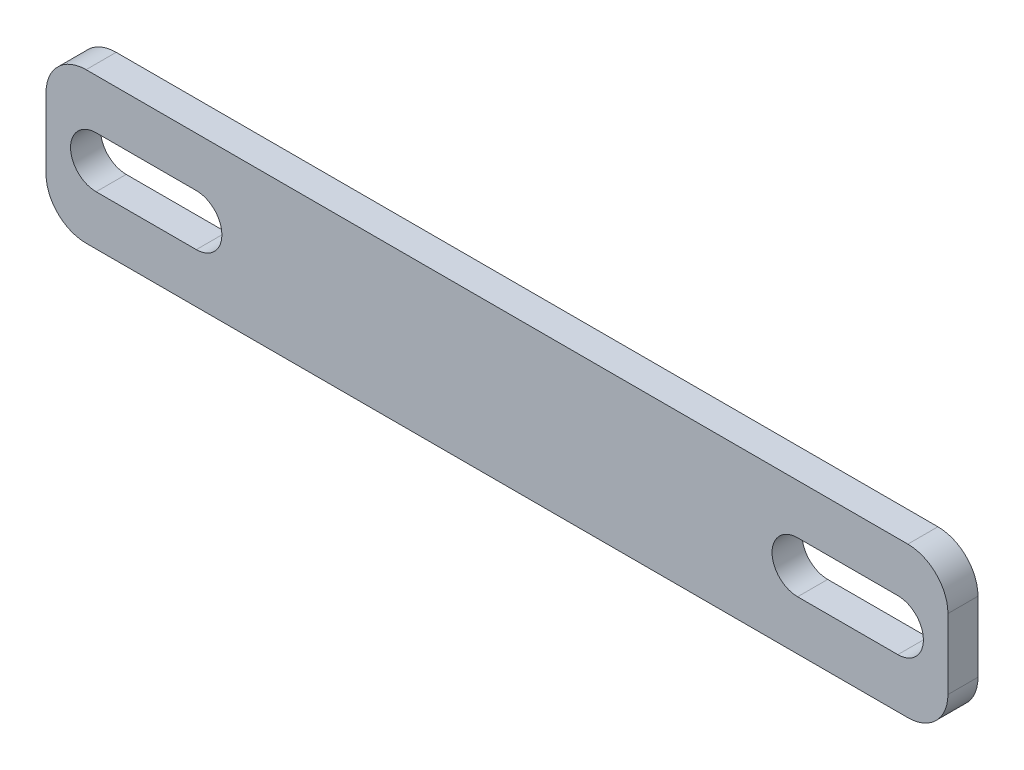
ISO-10303-21;
HEADER;
FILE_DESCRIPTION(('STEP AP214'),'2;1');
FILE_NAME('part.step','',(''),(''),'','','');
FILE_SCHEMA(('AUTOMOTIVE_DESIGN { 1 0 10303 214 1 1 1 1 }'));
ENDSEC;
DATA;
#1=APPLICATION_CONTEXT('core data for automotive mechanical design processes');
#2=APPLICATION_PROTOCOL_DEFINITION('international standard','automotive_design',2000,#1);
#3=PRODUCT_CONTEXT('',#1,'mechanical');
#4=PRODUCT('Part','Part','',(#3));
#5=PRODUCT_RELATED_PRODUCT_CATEGORY('part','',(#4));
#6=PRODUCT_DEFINITION_FORMATION('','',#4);
#7=PRODUCT_DEFINITION_CONTEXT('part definition',#1,'design');
#8=PRODUCT_DEFINITION('design','',#6,#7);
#9=PRODUCT_DEFINITION_SHAPE('','',#8);
#10=(LENGTH_UNIT() NAMED_UNIT(*) SI_UNIT(.MILLI.,.METRE.));
#11=(NAMED_UNIT(*) PLANE_ANGLE_UNIT() SI_UNIT($,.RADIAN.));
#12=(NAMED_UNIT(*) SI_UNIT($,.STERADIAN.) SOLID_ANGLE_UNIT());
#13=UNCERTAINTY_MEASURE_WITH_UNIT(LENGTH_MEASURE(1.E-05),#10,'distance_accuracy_value','');
#14=(GEOMETRIC_REPRESENTATION_CONTEXT(3) GLOBAL_UNCERTAINTY_ASSIGNED_CONTEXT((#13)) GLOBAL_UNIT_ASSIGNED_CONTEXT((#10,
#11,#12)) REPRESENTATION_CONTEXT('',''));
#15=CARTESIAN_POINT('',(0.,0.,0.));
#16=DIRECTION('',(0.,0.,1.));
#17=DIRECTION('',(1.,0.,0.));
#18=AXIS2_PLACEMENT_3D('',#15,#16,#17);
#19=CARTESIAN_POINT('',(86.,3.99999999999999,3.));
#20=DIRECTION('',(0.,0.,1.));
#21=DIRECTION('',(1.,0.,0.));
#22=AXIS2_PLACEMENT_3D('',#19,#20,#21);
#23=PLANE('',#22);
#24=DIRECTION('',(-1.,0.,0.));
#25=VECTOR('',#24,1.);
#26=CARTESIAN_POINT('',(15.,10.05,3.));
#27=LINE('',#26,#25);
#28=CARTESIAN_POINT('',(15.,10.05,3.));
#29=VERTEX_POINT('',#28);
#30=CARTESIAN_POINT('',(5.,10.05,3.));
#31=VERTEX_POINT('',#30);
#32=EDGE_CURVE('E184',#29,#31,#27,.T.);
#33=ORIENTED_EDGE('',*,*,#32,.F.);
#34=CARTESIAN_POINT('',(15.,7.5,3.));
#35=DIRECTION('',(0.,0.,1.));
#36=DIRECTION('',(1.,0.,0.));
#37=AXIS2_PLACEMENT_3D('',#34,#35,#36);
#38=CIRCLE('',#37,2.55);
#39=CARTESIAN_POINT('',(15.,4.95,3.));
#40=VERTEX_POINT('',#39);
#41=EDGE_CURVE('E182',#40,#29,#38,.T.);
#42=ORIENTED_EDGE('',*,*,#41,.F.);
#43=DIRECTION('',(1.,0.,0.));
#44=VECTOR('',#43,1.);
#45=CARTESIAN_POINT('',(5.,4.95,3.));
#46=LINE('',#45,#44);
#47=CARTESIAN_POINT('',(5.,4.95,3.));
#48=VERTEX_POINT('',#47);
#49=EDGE_CURVE('E190',#48,#40,#46,.T.);
#50=ORIENTED_EDGE('',*,*,#49,.F.);
#51=CARTESIAN_POINT('',(5.,7.5,3.));
#52=DIRECTION('',(0.,0.,1.));
#53=DIRECTION('',(1.,0.,0.));
#54=AXIS2_PLACEMENT_3D('',#51,#52,#53);
#55=CIRCLE('',#54,2.55);
#56=EDGE_CURVE('E187',#31,#48,#55,.T.);
#57=ORIENTED_EDGE('',*,*,#56,.F.);
#58=EDGE_LOOP('',(#33,#42,#50,#57));
#59=FACE_BOUND('',#58,.T.);
#60=CARTESIAN_POINT('',(86.,3.99999999999999,3.));
#61=DIRECTION('',(0.,0.,1.));
#62=DIRECTION('',(1.,0.,0.));
#63=AXIS2_PLACEMENT_3D('',#60,#61,#62);
#64=CIRCLE('',#63,4.);
#65=CARTESIAN_POINT('',(86.,0.,3.));
#66=VERTEX_POINT('',#65);
#67=CARTESIAN_POINT('',(90.,4.,3.));
#68=VERTEX_POINT('',#67);
#69=EDGE_CURVE('E213',#66,#68,#64,.T.);
#70=ORIENTED_EDGE('',*,*,#69,.T.);
#71=DIRECTION('',(0.,1.,0.));
#72=VECTOR('',#71,1.);
#73=CARTESIAN_POINT('',(90.,4.,3.));
#74=LINE('',#73,#72);
#75=CARTESIAN_POINT('',(90.,11.,3.));
#76=VERTEX_POINT('',#75);
#77=EDGE_CURVE('E216',#68,#76,#74,.T.);
#78=ORIENTED_EDGE('',*,*,#77,.T.);
#79=CARTESIAN_POINT('',(86.,11.,3.));
#80=DIRECTION('',(0.,0.,1.));
#81=DIRECTION('',(1.,0.,0.));
#82=AXIS2_PLACEMENT_3D('',#79,#80,#81);
#83=CIRCLE('',#82,4.);
#84=CARTESIAN_POINT('',(86.,15.,3.));
#85=VERTEX_POINT('',#84);
#86=EDGE_CURVE('E219',#76,#85,#83,.T.);
#87=ORIENTED_EDGE('',*,*,#86,.T.);
#88=DIRECTION('',(-1.,0.,0.));
#89=VECTOR('',#88,1.);
#90=CARTESIAN_POINT('',(86.,15.,3.));
#91=LINE('',#90,#89);
#92=CARTESIAN_POINT('',(4.,15.,3.));
#93=VERTEX_POINT('',#92);
#94=EDGE_CURVE('E221',#85,#93,#91,.T.);
#95=ORIENTED_EDGE('',*,*,#94,.T.);
#96=CARTESIAN_POINT('',(4.,11.,3.));
#97=DIRECTION('',(0.,0.,1.));
#98=DIRECTION('',(1.,0.,0.));
#99=AXIS2_PLACEMENT_3D('',#96,#97,#98);
#100=CIRCLE('',#99,4.);
#101=CARTESIAN_POINT('',(0.,11.,3.));
#102=VERTEX_POINT('',#101);
#103=EDGE_CURVE('E223',#93,#102,#100,.T.);
#104=ORIENTED_EDGE('',*,*,#103,.T.);
#105=DIRECTION('',(0.,-1.,0.));
#106=VECTOR('',#105,1.);
#107=CARTESIAN_POINT('',(0.,11.,3.));
#108=LINE('',#107,#106);
#109=CARTESIAN_POINT('',(0.,4.,3.));
#110=VERTEX_POINT('',#109);
#111=EDGE_CURVE('E225',#102,#110,#108,.T.);
#112=ORIENTED_EDGE('',*,*,#111,.T.);
#113=CARTESIAN_POINT('',(4.,4.,3.));
#114=DIRECTION('',(0.,0.,1.));
#115=DIRECTION('',(1.,0.,0.));
#116=AXIS2_PLACEMENT_3D('',#113,#114,#115);
#117=CIRCLE('',#116,4.);
#118=CARTESIAN_POINT('',(4.,0.,3.));
#119=VERTEX_POINT('',#118);
#120=EDGE_CURVE('E227',#110,#119,#117,.T.);
#121=ORIENTED_EDGE('',*,*,#120,.T.);
#122=DIRECTION('',(1.,0.,0.));
#123=VECTOR('',#122,1.);
#124=CARTESIAN_POINT('',(4.,0.,3.));
#125=LINE('',#124,#123);
#126=EDGE_CURVE('E229',#119,#66,#125,.T.);
#127=ORIENTED_EDGE('',*,*,#126,.T.);
#128=EDGE_LOOP('',(#70,#78,#87,#95,#104,#112,#121,#127));
#129=FACE_BOUND('',#128,.T.);
#130=DIRECTION('',(-1.,0.,0.));
#131=VECTOR('',#130,1.);
#132=CARTESIAN_POINT('',(85.,10.05,3.));
#133=LINE('',#132,#131);
#134=CARTESIAN_POINT('',(85.,10.05,3.));
#135=VERTEX_POINT('',#134);
#136=CARTESIAN_POINT('',(75.,10.05,3.));
#137=VERTEX_POINT('',#136);
#138=EDGE_CURVE('E154',#135,#137,#133,.T.);
#139=ORIENTED_EDGE('',*,*,#138,.F.);
#140=CARTESIAN_POINT('',(85.,7.5,3.));
#141=DIRECTION('',(0.,0.,1.));
#142=DIRECTION('',(1.,0.,0.));
#143=AXIS2_PLACEMENT_3D('',#140,#141,#142);
#144=CIRCLE('',#143,2.55);
#145=CARTESIAN_POINT('',(85.,4.95,3.));
#146=VERTEX_POINT('',#145);
#147=EDGE_CURVE('E146',#146,#135,#144,.T.);
#148=ORIENTED_EDGE('',*,*,#147,.F.);
#149=DIRECTION('',(1.,0.,0.));
#150=VECTOR('',#149,1.);
#151=CARTESIAN_POINT('',(75.,4.95,3.));
#152=LINE('',#151,#150);
#153=CARTESIAN_POINT('',(75.,4.95,3.));
#154=VERTEX_POINT('',#153);
#155=EDGE_CURVE('E168',#154,#146,#152,.T.);
#156=ORIENTED_EDGE('',*,*,#155,.F.);
#157=CARTESIAN_POINT('',(75.,7.5,3.));
#158=DIRECTION('',(0.,0.,1.));
#159=DIRECTION('',(1.,0.,0.));
#160=AXIS2_PLACEMENT_3D('',#157,#158,#159);
#161=CIRCLE('',#160,2.55);
#162=EDGE_CURVE('E166',#137,#154,#161,.T.);
#163=ORIENTED_EDGE('',*,*,#162,.F.);
#164=EDGE_LOOP('',(#139,#148,#156,#163));
#165=FACE_BOUND('',#164,.T.);
#166=ADVANCED_FACE('F33',(#59,#129,#165),#23,.T.);
#167=CARTESIAN_POINT('',(86.,3.99999999999999,0.));
#168=DIRECTION('',(0.,0.,1.));
#169=DIRECTION('',(1.,0.,0.));
#170=AXIS2_PLACEMENT_3D('',#167,#168,#169);
#171=PLANE('',#170);
#172=CARTESIAN_POINT('',(15.,7.5,0.));
#173=DIRECTION('',(0.,0.,1.));
#174=DIRECTION('',(1.,0.,0.));
#175=AXIS2_PLACEMENT_3D('',#172,#173,#174);
#176=CIRCLE('',#175,2.55);
#177=CARTESIAN_POINT('',(15.,4.95,0.));
#178=VERTEX_POINT('',#177);
#179=CARTESIAN_POINT('',(15.,10.05,0.));
#180=VERTEX_POINT('',#179);
#181=EDGE_CURVE('E162',#178,#180,#176,.T.);
#182=ORIENTED_EDGE('',*,*,#181,.T.);
#183=DIRECTION('',(-1.,0.,0.));
#184=VECTOR('',#183,1.);
#185=CARTESIAN_POINT('',(15.,10.05,0.));
#186=LINE('',#185,#184);
#187=CARTESIAN_POINT('',(5.,10.05,0.));
#188=VERTEX_POINT('',#187);
#189=EDGE_CURVE('E195',#180,#188,#186,.T.);
#190=ORIENTED_EDGE('',*,*,#189,.T.);
#191=CARTESIAN_POINT('',(5.,7.5,0.));
#192=DIRECTION('',(0.,0.,1.));
#193=DIRECTION('',(1.,0.,0.));
#194=AXIS2_PLACEMENT_3D('',#191,#192,#193);
#195=CIRCLE('',#194,2.55);
#196=CARTESIAN_POINT('',(5.,4.95,0.));
#197=VERTEX_POINT('',#196);
#198=EDGE_CURVE('E198',#188,#197,#195,.T.);
#199=ORIENTED_EDGE('',*,*,#198,.T.);
#200=DIRECTION('',(1.,0.,0.));
#201=VECTOR('',#200,1.);
#202=CARTESIAN_POINT('',(5.,4.95,0.));
#203=LINE('',#202,#201);
#204=EDGE_CURVE('E185',#197,#178,#203,.T.);
#205=ORIENTED_EDGE('',*,*,#204,.T.);
#206=EDGE_LOOP('',(#182,#190,#199,#205));
#207=FACE_BOUND('',#206,.T.);
#208=CARTESIAN_POINT('',(86.,3.99999999999999,0.));
#209=DIRECTION('',(0.,0.,1.));
#210=DIRECTION('',(1.,0.,0.));
#211=AXIS2_PLACEMENT_3D('',#208,#209,#210);
#212=CIRCLE('',#211,4.);
#213=CARTESIAN_POINT('',(86.,0.,0.));
#214=VERTEX_POINT('',#213);
#215=CARTESIAN_POINT('',(90.,4.,0.));
#216=VERTEX_POINT('',#215);
#217=EDGE_CURVE('E212',#214,#216,#212,.T.);
#218=ORIENTED_EDGE('',*,*,#217,.F.);
#219=DIRECTION('',(1.,0.,0.));
#220=VECTOR('',#219,1.);
#221=CARTESIAN_POINT('',(4.,0.,0.));
#222=LINE('',#221,#220);
#223=CARTESIAN_POINT('',(4.,0.,0.));
#224=VERTEX_POINT('',#223);
#225=EDGE_CURVE('E217',#224,#214,#222,.T.);
#226=ORIENTED_EDGE('',*,*,#225,.F.);
#227=CARTESIAN_POINT('',(4.,4.,0.));
#228=DIRECTION('',(0.,0.,1.));
#229=DIRECTION('',(1.,0.,0.));
#230=AXIS2_PLACEMENT_3D('',#227,#228,#229);
#231=CIRCLE('',#230,4.);
#232=CARTESIAN_POINT('',(0.,4.,0.));
#233=VERTEX_POINT('',#232);
#234=EDGE_CURVE('E244',#233,#224,#231,.T.);
#235=ORIENTED_EDGE('',*,*,#234,.F.);
#236=DIRECTION('',(0.,-1.,0.));
#237=VECTOR('',#236,1.);
#238=CARTESIAN_POINT('',(0.,11.,0.));
#239=LINE('',#238,#237);
#240=CARTESIAN_POINT('',(0.,11.,0.));
#241=VERTEX_POINT('',#240);
#242=EDGE_CURVE('E242',#241,#233,#239,.T.);
#243=ORIENTED_EDGE('',*,*,#242,.F.);
#244=CARTESIAN_POINT('',(4.,11.,0.));
#245=DIRECTION('',(0.,0.,1.));
#246=DIRECTION('',(1.,0.,0.));
#247=AXIS2_PLACEMENT_3D('',#244,#245,#246);
#248=CIRCLE('',#247,4.);
#249=CARTESIAN_POINT('',(4.,15.,0.));
#250=VERTEX_POINT('',#249);
#251=EDGE_CURVE('E240',#250,#241,#248,.T.);
#252=ORIENTED_EDGE('',*,*,#251,.F.);
#253=DIRECTION('',(-1.,0.,0.));
#254=VECTOR('',#253,1.);
#255=CARTESIAN_POINT('',(86.,15.,0.));
#256=LINE('',#255,#254);
#257=CARTESIAN_POINT('',(86.,15.,0.));
#258=VERTEX_POINT('',#257);
#259=EDGE_CURVE('E238',#258,#250,#256,.T.);
#260=ORIENTED_EDGE('',*,*,#259,.F.);
#261=CARTESIAN_POINT('',(86.,11.,0.));
#262=DIRECTION('',(0.,0.,1.));
#263=DIRECTION('',(1.,0.,0.));
#264=AXIS2_PLACEMENT_3D('',#261,#262,#263);
#265=CIRCLE('',#264,4.);
#266=CARTESIAN_POINT('',(90.,11.,0.));
#267=VERTEX_POINT('',#266);
#268=EDGE_CURVE('E236',#267,#258,#265,.T.);
#269=ORIENTED_EDGE('',*,*,#268,.F.);
#270=DIRECTION('',(0.,1.,0.));
#271=VECTOR('',#270,1.);
#272=CARTESIAN_POINT('',(90.,4.,0.));
#273=LINE('',#272,#271);
#274=EDGE_CURVE('E234',#216,#267,#273,.T.);
#275=ORIENTED_EDGE('',*,*,#274,.F.);
#276=EDGE_LOOP('',(#218,#226,#235,#243,#252,#260,#269,#275));
#277=FACE_BOUND('',#276,.T.);
#278=CARTESIAN_POINT('',(85.,7.5,0.));
#279=DIRECTION('',(0.,0.,1.));
#280=DIRECTION('',(1.,0.,0.));
#281=AXIS2_PLACEMENT_3D('',#278,#279,#280);
#282=CIRCLE('',#281,2.55);
#283=CARTESIAN_POINT('',(85.,4.95,0.));
#284=VERTEX_POINT('',#283);
#285=CARTESIAN_POINT('',(85.,10.05,0.));
#286=VERTEX_POINT('',#285);
#287=EDGE_CURVE('E56',#284,#286,#282,.T.);
#288=ORIENTED_EDGE('',*,*,#287,.T.);
#289=DIRECTION('',(-1.,0.,0.));
#290=VECTOR('',#289,1.);
#291=CARTESIAN_POINT('',(85.,10.05,0.));
#292=LINE('',#291,#290);
#293=CARTESIAN_POINT('',(75.,10.05,0.));
#294=VERTEX_POINT('',#293);
#295=EDGE_CURVE('E161',#286,#294,#292,.T.);
#296=ORIENTED_EDGE('',*,*,#295,.T.);
#297=CARTESIAN_POINT('',(75.,7.5,0.));
#298=DIRECTION('',(0.,0.,1.));
#299=DIRECTION('',(1.,0.,0.));
#300=AXIS2_PLACEMENT_3D('',#297,#298,#299);
#301=CIRCLE('',#300,2.55);
#302=CARTESIAN_POINT('',(75.,4.95,0.));
#303=VERTEX_POINT('',#302);
#304=EDGE_CURVE('E174',#294,#303,#301,.T.);
#305=ORIENTED_EDGE('',*,*,#304,.T.);
#306=DIRECTION('',(1.,0.,0.));
#307=VECTOR('',#306,1.);
#308=CARTESIAN_POINT('',(75.,4.95,0.));
#309=LINE('',#308,#307);
#310=EDGE_CURVE('E155',#303,#284,#309,.T.);
#311=ORIENTED_EDGE('',*,*,#310,.T.);
#312=EDGE_LOOP('',(#288,#296,#305,#311));
#313=FACE_BOUND('',#312,.T.);
#314=ADVANCED_FACE('F274',(#207,#277,#313),#171,.F.);
#315=CARTESIAN_POINT('',(86.,3.99999999999999,3.));
#316=DIRECTION('',(0.,0.,-1.));
#317=DIRECTION('',(-1.,0.,0.));
#318=AXIS2_PLACEMENT_3D('',#315,#316,#317);
#319=CYLINDRICAL_SURFACE('',#318,4.);
#320=ORIENTED_EDGE('',*,*,#217,.T.);
#321=DIRECTION('',(0.,0.,-1.));
#322=VECTOR('',#321,1.);
#323=CARTESIAN_POINT('',(90.,4.,3.));
#324=LINE('',#323,#322);
#325=EDGE_CURVE('E11',#68,#216,#324,.T.);
#326=ORIENTED_EDGE('',*,*,#325,.F.);
#327=ORIENTED_EDGE('',*,*,#69,.F.);
#328=DIRECTION('',(0.,0.,-1.));
#329=VECTOR('',#328,1.);
#330=CARTESIAN_POINT('',(86.,0.,3.));
#331=LINE('',#330,#329);
#332=EDGE_CURVE('E231',#66,#214,#331,.T.);
#333=ORIENTED_EDGE('',*,*,#332,.T.);
#334=EDGE_LOOP('',(#320,#326,#327,#333));
#335=FACE_BOUND('',#334,.T.);
#336=ADVANCED_FACE('F35',(#335),#319,.T.);
#337=CARTESIAN_POINT('',(90.,4.,3.));
#338=DIRECTION('',(-1.,0.,0.));
#339=DIRECTION('',(0.,0.,1.));
#340=AXIS2_PLACEMENT_3D('',#337,#338,#339);
#341=PLANE('',#340);
#342=ORIENTED_EDGE('',*,*,#274,.T.);
#343=DIRECTION('',(0.,0.,-1.));
#344=VECTOR('',#343,1.);
#345=CARTESIAN_POINT('',(90.,11.,3.));
#346=LINE('',#345,#344);
#347=EDGE_CURVE('E41',#76,#267,#346,.T.);
#348=ORIENTED_EDGE('',*,*,#347,.F.);
#349=ORIENTED_EDGE('',*,*,#77,.F.);
#350=ORIENTED_EDGE('',*,*,#325,.T.);
#351=EDGE_LOOP('',(#342,#348,#349,#350));
#352=FACE_BOUND('',#351,.T.);
#353=ADVANCED_FACE('F291',(#352),#341,.F.);
#354=CARTESIAN_POINT('',(86.,11.,3.));
#355=DIRECTION('',(0.,0.,-1.));
#356=DIRECTION('',(-1.,0.,0.));
#357=AXIS2_PLACEMENT_3D('',#354,#355,#356);
#358=CYLINDRICAL_SURFACE('',#357,4.);
#359=ORIENTED_EDGE('',*,*,#268,.T.);
#360=DIRECTION('',(0.,0.,-1.));
#361=VECTOR('',#360,1.);
#362=CARTESIAN_POINT('',(86.,15.,3.));
#363=LINE('',#362,#361);
#364=EDGE_CURVE('E261',#85,#258,#363,.T.);
#365=ORIENTED_EDGE('',*,*,#364,.F.);
#366=ORIENTED_EDGE('',*,*,#86,.F.);
#367=ORIENTED_EDGE('',*,*,#347,.T.);
#368=EDGE_LOOP('',(#359,#365,#366,#367));
#369=FACE_BOUND('',#368,.T.);
#370=ADVANCED_FACE('F268',(#369),#358,.T.);
#371=CARTESIAN_POINT('',(86.,15.,3.));
#372=DIRECTION('',(0.,-1.,0.));
#373=DIRECTION('',(1.,0.,0.));
#374=AXIS2_PLACEMENT_3D('',#371,#372,#373);
#375=PLANE('',#374);
#376=ORIENTED_EDGE('',*,*,#259,.T.);
#377=DIRECTION('',(0.,0.,-1.));
#378=VECTOR('',#377,1.);
#379=CARTESIAN_POINT('',(4.,15.,3.));
#380=LINE('',#379,#378);
#381=EDGE_CURVE('E258',#93,#250,#380,.T.);
#382=ORIENTED_EDGE('',*,*,#381,.F.);
#383=ORIENTED_EDGE('',*,*,#94,.F.);
#384=ORIENTED_EDGE('',*,*,#364,.T.);
#385=EDGE_LOOP('',(#376,#382,#383,#384));
#386=FACE_BOUND('',#385,.T.);
#387=ADVANCED_FACE('F280',(#386),#375,.F.);
#388=CARTESIAN_POINT('',(4.,11.,3.));
#389=DIRECTION('',(0.,0.,-1.));
#390=DIRECTION('',(-1.,0.,0.));
#391=AXIS2_PLACEMENT_3D('',#388,#389,#390);
#392=CYLINDRICAL_SURFACE('',#391,4.);
#393=ORIENTED_EDGE('',*,*,#251,.T.);
#394=DIRECTION('',(0.,0.,-1.));
#395=VECTOR('',#394,1.);
#396=CARTESIAN_POINT('',(0.,11.,3.));
#397=LINE('',#396,#395);
#398=EDGE_CURVE('E255',#102,#241,#397,.T.);
#399=ORIENTED_EDGE('',*,*,#398,.F.);
#400=ORIENTED_EDGE('',*,*,#103,.F.);
#401=ORIENTED_EDGE('',*,*,#381,.T.);
#402=EDGE_LOOP('',(#393,#399,#400,#401));
#403=FACE_BOUND('',#402,.T.);
#404=ADVANCED_FACE('F284',(#403),#392,.T.);
#405=CARTESIAN_POINT('',(0.,11.,3.));
#406=DIRECTION('',(1.,0.,0.));
#407=DIRECTION('',(0.,1.,0.));
#408=AXIS2_PLACEMENT_3D('',#405,#406,#407);
#409=PLANE('',#408);
#410=ORIENTED_EDGE('',*,*,#242,.T.);
#411=DIRECTION('',(0.,0.,-1.));
#412=VECTOR('',#411,1.);
#413=CARTESIAN_POINT('',(0.,4.,3.));
#414=LINE('',#413,#412);
#415=EDGE_CURVE('E252',#110,#233,#414,.T.);
#416=ORIENTED_EDGE('',*,*,#415,.F.);
#417=ORIENTED_EDGE('',*,*,#111,.F.);
#418=ORIENTED_EDGE('',*,*,#398,.T.);
#419=EDGE_LOOP('',(#410,#416,#417,#418));
#420=FACE_BOUND('',#419,.T.);
#421=ADVANCED_FACE('F304',(#420),#409,.F.);
#422=CARTESIAN_POINT('',(4.,4.,3.));
#423=DIRECTION('',(0.,0.,-1.));
#424=DIRECTION('',(-1.,0.,0.));
#425=AXIS2_PLACEMENT_3D('',#422,#423,#424);
#426=CYLINDRICAL_SURFACE('',#425,4.);
#427=ORIENTED_EDGE('',*,*,#234,.T.);
#428=DIRECTION('',(0.,0.,-1.));
#429=VECTOR('',#428,1.);
#430=CARTESIAN_POINT('',(4.,0.,3.));
#431=LINE('',#430,#429);
#432=EDGE_CURVE('E249',#119,#224,#431,.T.);
#433=ORIENTED_EDGE('',*,*,#432,.F.);
#434=ORIENTED_EDGE('',*,*,#120,.F.);
#435=ORIENTED_EDGE('',*,*,#415,.T.);
#436=EDGE_LOOP('',(#427,#433,#434,#435));
#437=FACE_BOUND('',#436,.T.);
#438=ADVANCED_FACE('F302',(#437),#426,.T.);
#439=CARTESIAN_POINT('',(4.,0.,3.));
#440=DIRECTION('',(0.,1.,0.));
#441=DIRECTION('',(0.,0.,1.));
#442=AXIS2_PLACEMENT_3D('',#439,#440,#441);
#443=PLANE('',#442);
#444=ORIENTED_EDGE('',*,*,#225,.T.);
#445=ORIENTED_EDGE('',*,*,#332,.F.);
#446=ORIENTED_EDGE('',*,*,#126,.F.);
#447=ORIENTED_EDGE('',*,*,#432,.T.);
#448=EDGE_LOOP('',(#444,#445,#446,#447));
#449=FACE_BOUND('',#448,.T.);
#450=ADVANCED_FACE('F297',(#449),#443,.F.);
#451=CARTESIAN_POINT('',(15.,7.5,3.));
#452=DIRECTION('',(0.,0.,-1.));
#453=DIRECTION('',(-1.,0.,0.));
#454=AXIS2_PLACEMENT_3D('',#451,#452,#453);
#455=CYLINDRICAL_SURFACE('',#454,2.55);
#456=ORIENTED_EDGE('',*,*,#181,.F.);
#457=DIRECTION('',(0.,0.,-1.));
#458=VECTOR('',#457,1.);
#459=CARTESIAN_POINT('',(15.,4.95,3.));
#460=LINE('',#459,#458);
#461=EDGE_CURVE('E192',#40,#178,#460,.T.);
#462=ORIENTED_EDGE('',*,*,#461,.F.);
#463=ORIENTED_EDGE('',*,*,#41,.T.);
#464=DIRECTION('',(0.,0.,-1.));
#465=VECTOR('',#464,1.);
#466=CARTESIAN_POINT('',(15.,10.05,3.));
#467=LINE('',#466,#465);
#468=EDGE_CURVE('E209',#29,#180,#467,.T.);
#469=ORIENTED_EDGE('',*,*,#468,.T.);
#470=EDGE_LOOP('',(#456,#462,#463,#469));
#471=FACE_BOUND('',#470,.T.);
#472=ADVANCED_FACE('F323',(#471),#455,.F.);
#473=CARTESIAN_POINT('',(15.,10.05,3.));
#474=DIRECTION('',(0.,-1.,0.));
#475=DIRECTION('',(1.,0.,0.));
#476=AXIS2_PLACEMENT_3D('',#473,#474,#475);
#477=PLANE('',#476);
#478=ORIENTED_EDGE('',*,*,#189,.F.);
#479=ORIENTED_EDGE('',*,*,#468,.F.);
#480=ORIENTED_EDGE('',*,*,#32,.T.);
#481=DIRECTION('',(0.,0.,-1.));
#482=VECTOR('',#481,1.);
#483=CARTESIAN_POINT('',(5.,10.05,3.));
#484=LINE('',#483,#482);
#485=EDGE_CURVE('E207',#31,#188,#484,.T.);
#486=ORIENTED_EDGE('',*,*,#485,.T.);
#487=EDGE_LOOP('',(#478,#479,#480,#486));
#488=FACE_BOUND('',#487,.T.);
#489=ADVANCED_FACE('F330',(#488),#477,.T.);
#490=CARTESIAN_POINT('',(5.,7.5,3.));
#491=DIRECTION('',(0.,0.,-1.));
#492=DIRECTION('',(-1.,0.,0.));
#493=AXIS2_PLACEMENT_3D('',#490,#491,#492);
#494=CYLINDRICAL_SURFACE('',#493,2.55);
#495=ORIENTED_EDGE('',*,*,#198,.F.);
#496=ORIENTED_EDGE('',*,*,#485,.F.);
#497=ORIENTED_EDGE('',*,*,#56,.T.);
#498=DIRECTION('',(0.,0.,-1.));
#499=VECTOR('',#498,1.);
#500=CARTESIAN_POINT('',(5.,4.95,3.));
#501=LINE('',#500,#499);
#502=EDGE_CURVE('E205',#48,#197,#501,.T.);
#503=ORIENTED_EDGE('',*,*,#502,.T.);
#504=EDGE_LOOP('',(#495,#496,#497,#503));
#505=FACE_BOUND('',#504,.T.);
#506=ADVANCED_FACE('F335',(#505),#494,.F.);
#507=CARTESIAN_POINT('',(5.,4.95,3.));
#508=DIRECTION('',(0.,1.,0.));
#509=DIRECTION('',(0.,0.,1.));
#510=AXIS2_PLACEMENT_3D('',#507,#508,#509);
#511=PLANE('',#510);
#512=ORIENTED_EDGE('',*,*,#204,.F.);
#513=ORIENTED_EDGE('',*,*,#502,.F.);
#514=ORIENTED_EDGE('',*,*,#49,.T.);
#515=ORIENTED_EDGE('',*,*,#461,.T.);
#516=EDGE_LOOP('',(#512,#513,#514,#515));
#517=FACE_BOUND('',#516,.T.);
#518=ADVANCED_FACE('F342',(#517),#511,.T.);
#519=CARTESIAN_POINT('',(85.,7.5,3.));
#520=DIRECTION('',(0.,0.,-1.));
#521=DIRECTION('',(-1.,0.,0.));
#522=AXIS2_PLACEMENT_3D('',#519,#520,#521);
#523=CYLINDRICAL_SURFACE('',#522,2.55);
#524=ORIENTED_EDGE('',*,*,#287,.F.);
#525=DIRECTION('',(0.,0.,-1.));
#526=VECTOR('',#525,1.);
#527=CARTESIAN_POINT('',(85.,4.95,3.));
#528=LINE('',#527,#526);
#529=EDGE_CURVE('E150',#146,#284,#528,.T.);
#530=ORIENTED_EDGE('',*,*,#529,.F.);
#531=ORIENTED_EDGE('',*,*,#147,.T.);
#532=DIRECTION('',(0.,0.,-1.));
#533=VECTOR('',#532,1.);
#534=CARTESIAN_POINT('',(85.,10.05,3.));
#535=LINE('',#534,#533);
#536=EDGE_CURVE('E149',#135,#286,#535,.T.);
#537=ORIENTED_EDGE('',*,*,#536,.T.);
#538=EDGE_LOOP('',(#524,#530,#531,#537));
#539=FACE_BOUND('',#538,.T.);
#540=ADVANCED_FACE('F148',(#539),#523,.F.);
#541=CARTESIAN_POINT('',(85.,10.05,3.));
#542=DIRECTION('',(0.,-1.,0.));
#543=DIRECTION('',(1.,0.,0.));
#544=AXIS2_PLACEMENT_3D('',#541,#542,#543);
#545=PLANE('',#544);
#546=ORIENTED_EDGE('',*,*,#295,.F.);
#547=ORIENTED_EDGE('',*,*,#536,.F.);
#548=ORIENTED_EDGE('',*,*,#138,.T.);
#549=DIRECTION('',(0.,0.,-1.));
#550=VECTOR('',#549,1.);
#551=CARTESIAN_POINT('',(75.,10.05,3.));
#552=LINE('',#551,#550);
#553=EDGE_CURVE('E163',#137,#294,#552,.T.);
#554=ORIENTED_EDGE('',*,*,#553,.T.);
#555=EDGE_LOOP('',(#546,#547,#548,#554));
#556=FACE_BOUND('',#555,.T.);
#557=ADVANCED_FACE('F158',(#556),#545,.T.);
#558=CARTESIAN_POINT('',(75.,7.5,3.));
#559=DIRECTION('',(0.,0.,-1.));
#560=DIRECTION('',(-1.,0.,0.));
#561=AXIS2_PLACEMENT_3D('',#558,#559,#560);
#562=CYLINDRICAL_SURFACE('',#561,2.55);
#563=ORIENTED_EDGE('',*,*,#304,.F.);
#564=ORIENTED_EDGE('',*,*,#553,.F.);
#565=ORIENTED_EDGE('',*,*,#162,.T.);
#566=DIRECTION('',(0.,0.,-1.));
#567=VECTOR('',#566,1.);
#568=CARTESIAN_POINT('',(75.,4.95,3.));
#569=LINE('',#568,#567);
#570=EDGE_CURVE('E48',#154,#303,#569,.T.);
#571=ORIENTED_EDGE('',*,*,#570,.T.);
#572=EDGE_LOOP('',(#563,#564,#565,#571));
#573=FACE_BOUND('',#572,.T.);
#574=ADVANCED_FACE('F359',(#573),#562,.F.);
#575=CARTESIAN_POINT('',(75.,4.95,3.));
#576=DIRECTION('',(0.,1.,0.));
#577=DIRECTION('',(0.,0.,1.));
#578=AXIS2_PLACEMENT_3D('',#575,#576,#577);
#579=PLANE('',#578);
#580=ORIENTED_EDGE('',*,*,#310,.F.);
#581=ORIENTED_EDGE('',*,*,#570,.F.);
#582=ORIENTED_EDGE('',*,*,#155,.T.);
#583=ORIENTED_EDGE('',*,*,#529,.T.);
#584=EDGE_LOOP('',(#580,#581,#582,#583));
#585=FACE_BOUND('',#584,.T.);
#586=ADVANCED_FACE('F362',(#585),#579,.T.);
#587=CLOSED_SHELL('',(#166,#314,#336,#353,#370,#387,#404,#421,#438,#450,#472,#489,#506,#518,
#540,#557,#574,#586));
#588=MANIFOLD_SOLID_BREP('B2',#587);
#589=ADVANCED_BREP_SHAPE_REPRESENTATION('',(#18,#588),#14);
#590=SHAPE_DEFINITION_REPRESENTATION(#9,#589);
ENDSEC;
END-ISO-10303-21;
